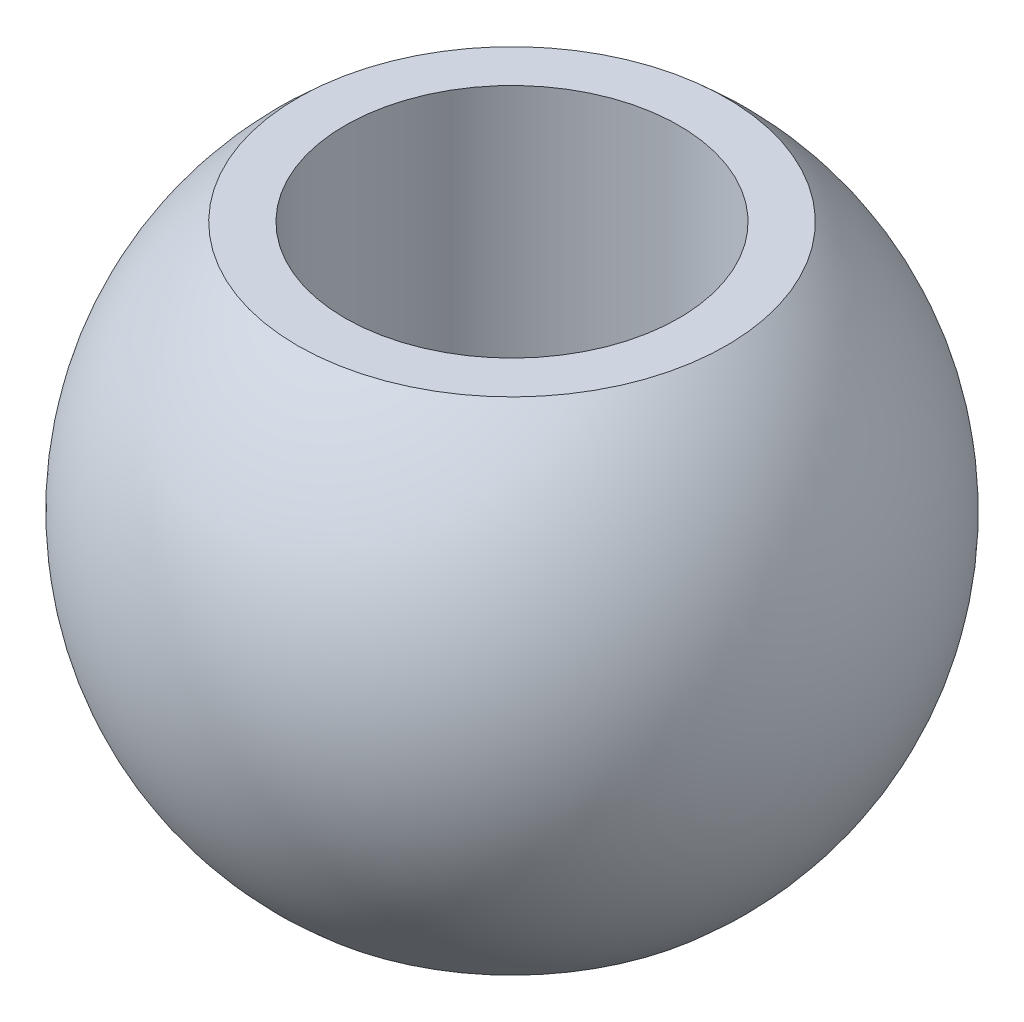
ISO-10303-21;
HEADER;
FILE_DESCRIPTION(('STEP AP214'),'2;1');
FILE_NAME('part.step','',(''),(''),'','','');
FILE_SCHEMA(('AUTOMOTIVE_DESIGN { 1 0 10303 214 1 1 1 1 }'));
ENDSEC;
DATA;
#1=APPLICATION_CONTEXT('core data for automotive mechanical design processes');
#2=APPLICATION_PROTOCOL_DEFINITION('international standard','automotive_design',2000,#1);
#3=PRODUCT_CONTEXT('',#1,'mechanical');
#4=PRODUCT('Part','Part','',(#3));
#5=PRODUCT_RELATED_PRODUCT_CATEGORY('part','',(#4));
#6=PRODUCT_DEFINITION_FORMATION('','',#4);
#7=PRODUCT_DEFINITION_CONTEXT('part definition',#1,'design');
#8=PRODUCT_DEFINITION('design','',#6,#7);
#9=PRODUCT_DEFINITION_SHAPE('','',#8);
#10=(LENGTH_UNIT() NAMED_UNIT(*) SI_UNIT(.MILLI.,.METRE.));
#11=(NAMED_UNIT(*) PLANE_ANGLE_UNIT() SI_UNIT($,.RADIAN.));
#12=(NAMED_UNIT(*) SI_UNIT($,.STERADIAN.) SOLID_ANGLE_UNIT());
#13=UNCERTAINTY_MEASURE_WITH_UNIT(LENGTH_MEASURE(1.E-05),#10,'distance_accuracy_value','');
#14=(GEOMETRIC_REPRESENTATION_CONTEXT(3) GLOBAL_UNCERTAINTY_ASSIGNED_CONTEXT((#13)) GLOBAL_UNIT_ASSIGNED_CONTEXT((#10,
#11,#12)) REPRESENTATION_CONTEXT('',''));
#15=CARTESIAN_POINT('',(0.,0.,0.));
#16=DIRECTION('',(0.,0.,1.));
#17=DIRECTION('',(1.,0.,0.));
#18=AXIS2_PLACEMENT_3D('',#15,#16,#17);
#19=CARTESIAN_POINT('',(0.,0.,0.));
#20=DIRECTION('',(-1.,0.,0.));
#21=DIRECTION('',(0.,0.,-1.));
#22=AXIS2_PLACEMENT_3D('',#19,#20,#21);
#23=SPHERICAL_SURFACE('',#22,7.9);
#24=CARTESIAN_POINT('',(0.,0.,0.));
#25=DIRECTION('',(0.,1.,0.));
#26=DIRECTION('',(0.,0.,1.));
#27=AXIS2_PLACEMENT_3D('',#24,#25,#26);
#28=SPHERICAL_SURFACE('',#27,7.9);
#29=CARTESIAN_POINT('',(0.,-6.,0.));
#30=DIRECTION('',(0.,1.,0.));
#31=DIRECTION('',(0.,0.,1.));
#32=AXIS2_PLACEMENT_3D('',#29,#30,#31);
#33=CIRCLE('',#32,5.13906606301184);
#34=CARTESIAN_POINT('',(0.,-6.,5.13906606301184));
#35=VERTEX_POINT('',#34);
#36=EDGE_CURVE('E44',#35,#35,#33,.T.);
#37=ORIENTED_EDGE('',*,*,#36,.T.);
#38=EDGE_LOOP('',(#37));
#39=FACE_BOUND('',#38,.T.);
#40=CARTESIAN_POINT('',(0.,6.,0.));
#41=DIRECTION('',(0.,1.,0.));
#42=DIRECTION('',(0.,0.,1.));
#43=AXIS2_PLACEMENT_3D('',#40,#41,#42);
#44=CIRCLE('',#43,5.13906606301184);
#45=CARTESIAN_POINT('',(0.,6.,5.13906606301184));
#46=VERTEX_POINT('',#45);
#47=EDGE_CURVE('E10',#46,#46,#44,.T.);
#48=ORIENTED_EDGE('',*,*,#47,.F.);
#49=EDGE_LOOP('',(#48));
#50=FACE_BOUND('',#49,.T.);
#51=ADVANCED_FACE('F37',(#39,#50),#28,.T.);
#52=CARTESIAN_POINT('',(-7.9,-6.,0.));
#53=DIRECTION('',(0.,1.,0.));
#54=DIRECTION('',(0.,0.,1.));
#55=AXIS2_PLACEMENT_3D('',#52,#53,#54);
#56=PLANE('',#55);
#57=CARTESIAN_POINT('',(0.,-6.,0.));
#58=DIRECTION('',(0.,1.,0.));
#59=DIRECTION('',(0.,0.,1.));
#60=AXIS2_PLACEMENT_3D('',#57,#58,#59);
#61=CIRCLE('',#60,4.);
#62=CARTESIAN_POINT('',(0.,-6.,4.));
#63=VERTEX_POINT('',#62);
#64=EDGE_CURVE('E49',#63,#63,#61,.T.);
#65=ORIENTED_EDGE('',*,*,#64,.T.);
#66=EDGE_LOOP('',(#65));
#67=FACE_BOUND('',#66,.T.);
#68=ORIENTED_EDGE('',*,*,#36,.F.);
#69=EDGE_LOOP('',(#68));
#70=FACE_BOUND('',#69,.T.);
#71=ADVANCED_FACE('F65',(#67,#70),#56,.F.);
#72=CARTESIAN_POINT('',(-7.9,6.,0.));
#73=DIRECTION('',(0.,1.,0.));
#74=DIRECTION('',(0.,0.,1.));
#75=AXIS2_PLACEMENT_3D('',#72,#73,#74);
#76=PLANE('',#75);
#77=CARTESIAN_POINT('',(0.,6.,0.));
#78=DIRECTION('',(0.,1.,0.));
#79=DIRECTION('',(0.,0.,1.));
#80=AXIS2_PLACEMENT_3D('',#77,#78,#79);
#81=CIRCLE('',#80,4.);
#82=CARTESIAN_POINT('',(0.,6.,4.));
#83=VERTEX_POINT('',#82);
#84=EDGE_CURVE('E54',#83,#83,#81,.T.);
#85=ORIENTED_EDGE('',*,*,#84,.F.);
#86=EDGE_LOOP('',(#85));
#87=FACE_BOUND('',#86,.T.);
#88=ORIENTED_EDGE('',*,*,#47,.T.);
#89=EDGE_LOOP('',(#88));
#90=FACE_BOUND('',#89,.T.);
#91=ADVANCED_FACE('F63',(#87,#90),#76,.T.);
#92=CARTESIAN_POINT('',(0.,-6.,0.));
#93=DIRECTION('',(0.,1.,0.));
#94=DIRECTION('',(0.,0.,1.));
#95=AXIS2_PLACEMENT_3D('',#92,#93,#94);
#96=CYLINDRICAL_SURFACE('',#95,4.);
#97=ORIENTED_EDGE('',*,*,#64,.F.);
#98=EDGE_LOOP('',(#97));
#99=FACE_BOUND('',#98,.T.);
#100=ORIENTED_EDGE('',*,*,#84,.T.);
#101=EDGE_LOOP('',(#100));
#102=FACE_BOUND('',#101,.T.);
#103=ADVANCED_FACE('F61',(#99,#102),#96,.F.);
#104=CLOSED_SHELL('',(#51,#71,#91,#103));
#105=MANIFOLD_SOLID_BREP('B2',#104);
#106=ADVANCED_BREP_SHAPE_REPRESENTATION('',(#18,#105),#14);
#107=SHAPE_DEFINITION_REPRESENTATION(#9,#106);
ENDSEC;
END-ISO-10303-21;
